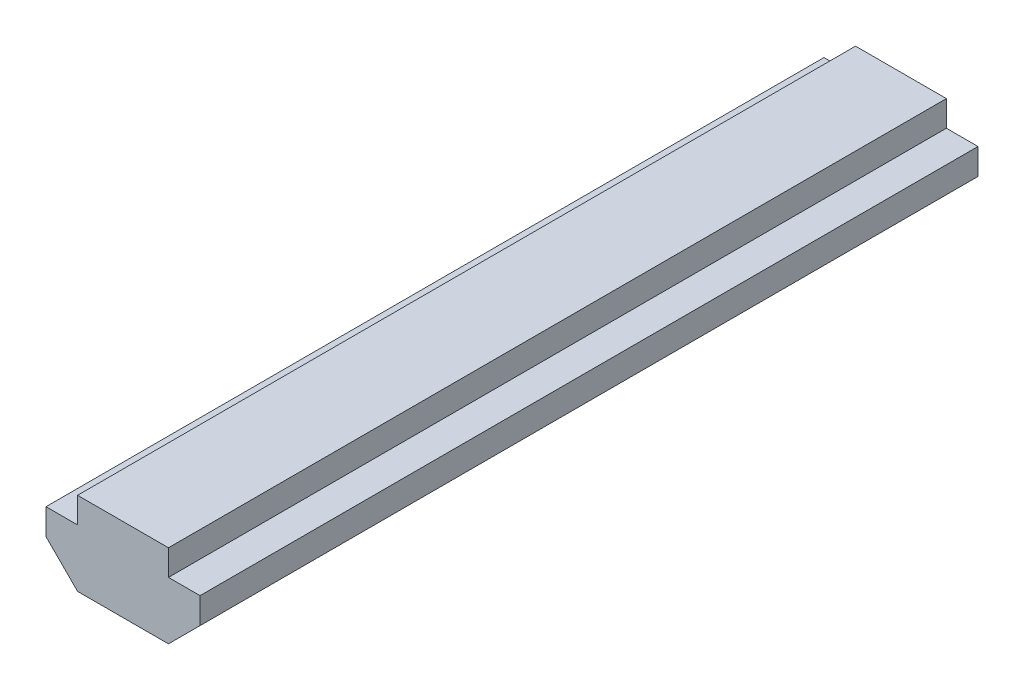
ISO-10303-21;
HEADER;
FILE_DESCRIPTION(('STEP AP214'),'2;1');
FILE_NAME('part.step','',(''),(''),'','','');
FILE_SCHEMA(('AUTOMOTIVE_DESIGN { 1 0 10303 214 1 1 1 1 }'));
ENDSEC;
DATA;
#1=APPLICATION_CONTEXT('core data for automotive mechanical design processes');
#2=APPLICATION_PROTOCOL_DEFINITION('international standard','automotive_design',2000,#1);
#3=PRODUCT_CONTEXT('',#1,'mechanical');
#4=PRODUCT('Part','Part','',(#3));
#5=PRODUCT_RELATED_PRODUCT_CATEGORY('part','',(#4));
#6=PRODUCT_DEFINITION_FORMATION('','',#4);
#7=PRODUCT_DEFINITION_CONTEXT('part definition',#1,'design');
#8=PRODUCT_DEFINITION('design','',#6,#7);
#9=PRODUCT_DEFINITION_SHAPE('','',#8);
#10=(LENGTH_UNIT() NAMED_UNIT(*) SI_UNIT(.MILLI.,.METRE.));
#11=(NAMED_UNIT(*) PLANE_ANGLE_UNIT() SI_UNIT($,.RADIAN.));
#12=(NAMED_UNIT(*) SI_UNIT($,.STERADIAN.) SOLID_ANGLE_UNIT());
#13=UNCERTAINTY_MEASURE_WITH_UNIT(LENGTH_MEASURE(1.E-05),#10,'distance_accuracy_value','');
#14=(GEOMETRIC_REPRESENTATION_CONTEXT(3) GLOBAL_UNCERTAINTY_ASSIGNED_CONTEXT((#13)) GLOBAL_UNIT_ASSIGNED_CONTEXT((#10,
#11,#12)) REPRESENTATION_CONTEXT('',''));
#15=CARTESIAN_POINT('',(0.,0.,0.));
#16=DIRECTION('',(0.,0.,1.));
#17=DIRECTION('',(1.,0.,0.));
#18=AXIS2_PLACEMENT_3D('',#15,#16,#17);
#19=CARTESIAN_POINT('',(4.0600000000004,-7.40000000000009,100.));
#20=DIRECTION('',(0.707106781186548,0.707106781186548,0.));
#21=DIRECTION('',(-0.707106781186548,0.707106781186548,0.));
#22=AXIS2_PLACEMENT_3D('',#19,#20,#21);
#23=PLANE('',#22);
#24=DIRECTION('',(0.707106781186548,-0.707106781186548,0.));
#25=VECTOR('',#24,1.);
#26=CARTESIAN_POINT('',(4.0600000000004,-7.40000000000009,0.));
#27=LINE('',#26,#25);
#28=CARTESIAN_POINT('',(4.5102810375397E-13,-3.34000000000015,0.));
#29=VERTEX_POINT('',#28);
#30=CARTESIAN_POINT('',(4.0600000000004,-7.40000000000009,0.));
#31=VERTEX_POINT('',#30);
#32=EDGE_CURVE('E143',#29,#31,#27,.T.);
#33=ORIENTED_EDGE('',*,*,#32,.T.);
#34=DIRECTION('',(0.,0.,-1.));
#35=VECTOR('',#34,1.);
#36=CARTESIAN_POINT('',(4.0600000000004,-7.40000000000009,100.));
#37=LINE('',#36,#35);
#38=CARTESIAN_POINT('',(4.0600000000004,-7.40000000000009,100.));
#39=VERTEX_POINT('',#38);
#40=EDGE_CURVE('E11',#39,#31,#37,.T.);
#41=ORIENTED_EDGE('',*,*,#40,.F.);
#42=DIRECTION('',(0.707106781186548,-0.707106781186548,0.));
#43=VECTOR('',#42,1.);
#44=CARTESIAN_POINT('',(4.0600000000004,-7.40000000000009,100.));
#45=LINE('',#44,#43);
#46=CARTESIAN_POINT('',(4.5102810375397E-13,-3.34000000000015,100.));
#47=VERTEX_POINT('',#46);
#48=EDGE_CURVE('E161',#47,#39,#45,.T.);
#49=ORIENTED_EDGE('',*,*,#48,.F.);
#50=DIRECTION('',(0.,0.,-1.));
#51=VECTOR('',#50,1.);
#52=CARTESIAN_POINT('',(4.5102810375397E-13,-3.34000000000015,100.));
#53=LINE('',#52,#51);
#54=EDGE_CURVE('E139',#47,#29,#53,.T.);
#55=ORIENTED_EDGE('',*,*,#54,.T.);
#56=EDGE_LOOP('',(#33,#41,#49,#55));
#57=FACE_BOUND('',#56,.T.);
#58=ADVANCED_FACE('F35',(#57),#23,.F.);
#59=CARTESIAN_POINT('',(4.0600000000004,-7.40000000000009,100.));
#60=DIRECTION('',(0.,1.,0.));
#61=DIRECTION('',(0.,0.,1.));
#62=AXIS2_PLACEMENT_3D('',#59,#60,#61);
#63=PLANE('',#62);
#64=DIRECTION('',(1.,0.,0.));
#65=VECTOR('',#64,1.);
#66=CARTESIAN_POINT('',(4.0600000000004,-7.40000000000009,0.));
#67=LINE('',#66,#65);
#68=CARTESIAN_POINT('',(15.7400000000007,-7.40000000000009,0.));
#69=VERTEX_POINT('',#68);
#70=EDGE_CURVE('E146',#31,#69,#67,.T.);
#71=ORIENTED_EDGE('',*,*,#70,.T.);
#72=DIRECTION('',(0.,0.,-1.));
#73=VECTOR('',#72,1.);
#74=CARTESIAN_POINT('',(15.7400000000007,-7.40000000000009,100.));
#75=LINE('',#74,#73);
#76=CARTESIAN_POINT('',(15.7400000000007,-7.40000000000009,100.));
#77=VERTEX_POINT('',#76);
#78=EDGE_CURVE('E43',#77,#69,#75,.T.);
#79=ORIENTED_EDGE('',*,*,#78,.F.);
#80=DIRECTION('',(1.,0.,0.));
#81=VECTOR('',#80,1.);
#82=CARTESIAN_POINT('',(4.0600000000004,-7.40000000000009,100.));
#83=LINE('',#82,#81);
#84=EDGE_CURVE('E100',#39,#77,#83,.T.);
#85=ORIENTED_EDGE('',*,*,#84,.F.);
#86=ORIENTED_EDGE('',*,*,#40,.T.);
#87=EDGE_LOOP('',(#71,#79,#85,#86));
#88=FACE_BOUND('',#87,.T.);
#89=ADVANCED_FACE('F210',(#88),#63,.F.);
#90=CARTESIAN_POINT('',(15.7400000000007,-7.40000000000009,100.));
#91=DIRECTION('',(-0.707106781186548,0.707106781186548,0.));
#92=DIRECTION('',(-0.707106781186548,-0.707106781186548,0.));
#93=AXIS2_PLACEMENT_3D('',#90,#91,#92);
#94=PLANE('',#93);
#95=DIRECTION('',(0.707106781186548,0.707106781186548,0.));
#96=VECTOR('',#95,1.);
#97=CARTESIAN_POINT('',(15.7400000000007,-7.40000000000009,0.));
#98=LINE('',#97,#96);
#99=CARTESIAN_POINT('',(19.8000000000006,-3.34000000000015,0.));
#100=VERTEX_POINT('',#99);
#101=EDGE_CURVE('E148',#69,#100,#98,.T.);
#102=ORIENTED_EDGE('',*,*,#101,.T.);
#103=DIRECTION('',(0.,0.,-1.));
#104=VECTOR('',#103,1.);
#105=CARTESIAN_POINT('',(19.8000000000006,-3.34000000000015,100.));
#106=LINE('',#105,#104);
#107=CARTESIAN_POINT('',(19.8000000000006,-3.34000000000015,100.));
#108=VERTEX_POINT('',#107);
#109=EDGE_CURVE('E174',#108,#100,#106,.T.);
#110=ORIENTED_EDGE('',*,*,#109,.F.);
#111=DIRECTION('',(0.707106781186548,0.707106781186548,0.));
#112=VECTOR('',#111,1.);
#113=CARTESIAN_POINT('',(15.7400000000007,-7.40000000000009,100.));
#114=LINE('',#113,#112);
#115=EDGE_CURVE('E182',#77,#108,#114,.T.);
#116=ORIENTED_EDGE('',*,*,#115,.F.);
#117=ORIENTED_EDGE('',*,*,#78,.T.);
#118=EDGE_LOOP('',(#102,#110,#116,#117));
#119=FACE_BOUND('',#118,.T.);
#120=ADVANCED_FACE('F180',(#119),#94,.F.);
#121=CARTESIAN_POINT('',(19.8000000000006,-3.34000000000015,100.));
#122=DIRECTION('',(-1.,0.,0.));
#123=DIRECTION('',(0.,0.,1.));
#124=AXIS2_PLACEMENT_3D('',#121,#122,#123);
#125=PLANE('',#124);
#126=DIRECTION('',(0.,1.,0.));
#127=VECTOR('',#126,1.);
#128=CARTESIAN_POINT('',(19.8000000000006,-3.34000000000015,0.));
#129=LINE('',#128,#127);
#130=CARTESIAN_POINT('',(19.8000000000006,0.,0.));
#131=VERTEX_POINT('',#130);
#132=EDGE_CURVE('E150',#100,#131,#129,.T.);
#133=ORIENTED_EDGE('',*,*,#132,.T.);
#134=DIRECTION('',(0.,0.,-1.));
#135=VECTOR('',#134,1.);
#136=CARTESIAN_POINT('',(19.8000000000006,0.,100.));
#137=LINE('',#136,#135);
#138=CARTESIAN_POINT('',(19.8000000000006,0.,100.));
#139=VERTEX_POINT('',#138);
#140=EDGE_CURVE('E171',#139,#131,#137,.T.);
#141=ORIENTED_EDGE('',*,*,#140,.F.);
#142=DIRECTION('',(0.,1.,0.));
#143=VECTOR('',#142,1.);
#144=CARTESIAN_POINT('',(19.8000000000006,-3.34000000000015,100.));
#145=LINE('',#144,#143);
#146=EDGE_CURVE('E200',#108,#139,#145,.T.);
#147=ORIENTED_EDGE('',*,*,#146,.F.);
#148=ORIENTED_EDGE('',*,*,#109,.T.);
#149=EDGE_LOOP('',(#133,#141,#147,#148));
#150=FACE_BOUND('',#149,.T.);
#151=ADVANCED_FACE('F191',(#150),#125,.F.);
#152=CARTESIAN_POINT('',(15.7400000000007,1.11022302462516E-13,100.));
#153=DIRECTION('',(0.,-1.,0.));
#154=DIRECTION('',(1.,0.,0.));
#155=AXIS2_PLACEMENT_3D('',#152,#153,#154);
#156=PLANE('',#155);
#157=DIRECTION('',(-1.,0.,0.));
#158=VECTOR('',#157,1.);
#159=CARTESIAN_POINT('',(15.7400000000007,1.11022302462516E-13,0.));
#160=LINE('',#159,#158);
#161=CARTESIAN_POINT('',(15.7400000000007,1.11022302462516E-13,0.));
#162=VERTEX_POINT('',#161);
#163=EDGE_CURVE('E152',#131,#162,#160,.T.);
#164=ORIENTED_EDGE('',*,*,#163,.T.);
#165=DIRECTION('',(0.,0.,-1.));
#166=VECTOR('',#165,1.);
#167=CARTESIAN_POINT('',(15.7400000000007,1.11022302462516E-13,100.));
#168=LINE('',#167,#166);
#169=CARTESIAN_POINT('',(15.7400000000007,1.11022302462516E-13,100.));
#170=VERTEX_POINT('',#169);
#171=EDGE_CURVE('E168',#170,#162,#168,.T.);
#172=ORIENTED_EDGE('',*,*,#171,.F.);
#173=DIRECTION('',(-1.,0.,0.));
#174=VECTOR('',#173,1.);
#175=CARTESIAN_POINT('',(15.7400000000007,1.11022302462516E-13,100.));
#176=LINE('',#175,#174);
#177=EDGE_CURVE('E197',#139,#170,#176,.T.);
#178=ORIENTED_EDGE('',*,*,#177,.F.);
#179=ORIENTED_EDGE('',*,*,#140,.T.);
#180=EDGE_LOOP('',(#164,#172,#178,#179));
#181=FACE_BOUND('',#180,.T.);
#182=ADVANCED_FACE('F195',(#181),#156,.F.);
#183=CARTESIAN_POINT('',(15.7400000000007,1.11022302462516E-13,100.));
#184=DIRECTION('',(-1.,0.,0.));
#185=DIRECTION('',(0.,0.,1.));
#186=AXIS2_PLACEMENT_3D('',#183,#184,#185);
#187=PLANE('',#186);
#188=DIRECTION('',(0.,1.,0.));
#189=VECTOR('',#188,1.);
#190=CARTESIAN_POINT('',(15.7400000000007,1.11022302462516E-13,0.));
#191=LINE('',#190,#189);
#192=CARTESIAN_POINT('',(15.7400000000007,3.29999999999995,0.));
#193=VERTEX_POINT('',#192);
#194=EDGE_CURVE('E154',#162,#193,#191,.T.);
#195=ORIENTED_EDGE('',*,*,#194,.T.);
#196=DIRECTION('',(0.,0.,-1.));
#197=VECTOR('',#196,1.);
#198=CARTESIAN_POINT('',(15.7400000000007,3.29999999999995,100.));
#199=LINE('',#198,#197);
#200=CARTESIAN_POINT('',(15.7400000000007,3.29999999999995,100.));
#201=VERTEX_POINT('',#200);
#202=EDGE_CURVE('E165',#201,#193,#199,.T.);
#203=ORIENTED_EDGE('',*,*,#202,.F.);
#204=DIRECTION('',(0.,1.,0.));
#205=VECTOR('',#204,1.);
#206=CARTESIAN_POINT('',(15.7400000000007,1.11022302462516E-13,100.));
#207=LINE('',#206,#205);
#208=EDGE_CURVE('E199',#170,#201,#207,.T.);
#209=ORIENTED_EDGE('',*,*,#208,.F.);
#210=ORIENTED_EDGE('',*,*,#171,.T.);
#211=EDGE_LOOP('',(#195,#203,#209,#210));
#212=FACE_BOUND('',#211,.T.);
#213=ADVANCED_FACE('F222',(#212),#187,.F.);
#214=CARTESIAN_POINT('',(4.0600000000004,3.29999999999995,100.));
#215=DIRECTION('',(0.,-1.,0.));
#216=DIRECTION('',(0.,0.,-1.));
#217=AXIS2_PLACEMENT_3D('',#214,#215,#216);
#218=PLANE('',#217);
#219=DIRECTION('',(-1.,0.,0.));
#220=VECTOR('',#219,1.);
#221=CARTESIAN_POINT('',(4.0600000000004,3.29999999999995,0.));
#222=LINE('',#221,#220);
#223=CARTESIAN_POINT('',(4.0600000000004,3.29999999999995,0.));
#224=VERTEX_POINT('',#223);
#225=EDGE_CURVE('E156',#193,#224,#222,.T.);
#226=ORIENTED_EDGE('',*,*,#225,.T.);
#227=DIRECTION('',(0.,0.,-1.));
#228=VECTOR('',#227,1.);
#229=CARTESIAN_POINT('',(4.0600000000004,3.29999999999995,100.));
#230=LINE('',#229,#228);
#231=CARTESIAN_POINT('',(4.0600000000004,3.29999999999995,100.));
#232=VERTEX_POINT('',#231);
#233=EDGE_CURVE('E134',#232,#224,#230,.T.);
#234=ORIENTED_EDGE('',*,*,#233,.F.);
#235=DIRECTION('',(-1.,0.,0.));
#236=VECTOR('',#235,1.);
#237=CARTESIAN_POINT('',(4.0600000000004,3.29999999999995,100.));
#238=LINE('',#237,#236);
#239=EDGE_CURVE('E125',#201,#232,#238,.T.);
#240=ORIENTED_EDGE('',*,*,#239,.F.);
#241=ORIENTED_EDGE('',*,*,#202,.T.);
#242=EDGE_LOOP('',(#226,#234,#240,#241));
#243=FACE_BOUND('',#242,.T.);
#244=ADVANCED_FACE('F225',(#243),#218,.F.);
#245=CARTESIAN_POINT('',(4.0600000000004,1.11022302462516E-13,100.));
#246=DIRECTION('',(1.,0.,0.));
#247=DIRECTION('',(0.,0.,-1.));
#248=AXIS2_PLACEMENT_3D('',#245,#246,#247);
#249=PLANE('',#248);
#250=DIRECTION('',(0.,-1.,0.));
#251=VECTOR('',#250,1.);
#252=CARTESIAN_POINT('',(4.0600000000004,1.11022302462516E-13,0.));
#253=LINE('',#252,#251);
#254=CARTESIAN_POINT('',(4.0600000000004,1.11022302462516E-13,0.));
#255=VERTEX_POINT('',#254);
#256=EDGE_CURVE('E133',#224,#255,#253,.T.);
#257=ORIENTED_EDGE('',*,*,#256,.T.);
#258=DIRECTION('',(0.,0.,-1.));
#259=VECTOR('',#258,1.);
#260=CARTESIAN_POINT('',(4.0600000000004,1.11022302462516E-13,100.));
#261=LINE('',#260,#259);
#262=CARTESIAN_POINT('',(4.0600000000004,1.11022302462516E-13,100.));
#263=VERTEX_POINT('',#262);
#264=EDGE_CURVE('E130',#263,#255,#261,.T.);
#265=ORIENTED_EDGE('',*,*,#264,.F.);
#266=DIRECTION('',(0.,-1.,0.));
#267=VECTOR('',#266,1.);
#268=CARTESIAN_POINT('',(4.0600000000004,1.11022302462516E-13,100.));
#269=LINE('',#268,#267);
#270=EDGE_CURVE('E119',#232,#263,#269,.T.);
#271=ORIENTED_EDGE('',*,*,#270,.F.);
#272=ORIENTED_EDGE('',*,*,#233,.T.);
#273=EDGE_LOOP('',(#257,#265,#271,#272));
#274=FACE_BOUND('',#273,.T.);
#275=ADVANCED_FACE('F131',(#274),#249,.F.);
#276=CARTESIAN_POINT('',(0.,0.,100.));
#277=DIRECTION('',(0.,-1.,0.));
#278=DIRECTION('',(1.,0.,0.));
#279=AXIS2_PLACEMENT_3D('',#276,#277,#278);
#280=PLANE('',#279);
#281=DIRECTION('',(-1.,0.,0.));
#282=VECTOR('',#281,1.);
#283=CARTESIAN_POINT('',(0.,0.,0.));
#284=LINE('',#283,#282);
#285=CARTESIAN_POINT('',(0.,0.,0.));
#286=VERTEX_POINT('',#285);
#287=EDGE_CURVE('E86',#255,#286,#284,.T.);
#288=ORIENTED_EDGE('',*,*,#287,.T.);
#289=DIRECTION('',(0.,0.,-1.));
#290=VECTOR('',#289,1.);
#291=CARTESIAN_POINT('',(0.,0.,100.));
#292=LINE('',#291,#290);
#293=CARTESIAN_POINT('',(0.,0.,100.));
#294=VERTEX_POINT('',#293);
#295=EDGE_CURVE('E135',#294,#286,#292,.T.);
#296=ORIENTED_EDGE('',*,*,#295,.F.);
#297=DIRECTION('',(-1.,0.,0.));
#298=VECTOR('',#297,1.);
#299=CARTESIAN_POINT('',(0.,0.,100.));
#300=LINE('',#299,#298);
#301=EDGE_CURVE('E123',#263,#294,#300,.T.);
#302=ORIENTED_EDGE('',*,*,#301,.F.);
#303=ORIENTED_EDGE('',*,*,#264,.T.);
#304=EDGE_LOOP('',(#288,#296,#302,#303));
#305=FACE_BOUND('',#304,.T.);
#306=ADVANCED_FACE('F137',(#305),#280,.F.);
#307=CARTESIAN_POINT('',(4.5102810375397E-13,-3.34000000000015,100.));
#308=DIRECTION('',(1.,1.36077110989791E-13,0.));
#309=DIRECTION('',(-1.36077110989791E-13,1.,0.));
#310=AXIS2_PLACEMENT_3D('',#307,#308,#309);
#311=PLANE('',#310);
#312=DIRECTION('',(1.36077110989791E-13,-1.,0.));
#313=VECTOR('',#312,1.);
#314=CARTESIAN_POINT('',(4.5102810375397E-13,-3.34000000000015,0.));
#315=LINE('',#314,#313);
#316=EDGE_CURVE('E92',#286,#29,#315,.T.);
#317=ORIENTED_EDGE('',*,*,#316,.T.);
#318=ORIENTED_EDGE('',*,*,#54,.F.);
#319=DIRECTION('',(1.36077110989791E-13,-1.,0.));
#320=VECTOR('',#319,1.);
#321=CARTESIAN_POINT('',(4.5102810375397E-13,-3.34000000000015,100.));
#322=LINE('',#321,#320);
#323=EDGE_CURVE('E51',#294,#47,#322,.T.);
#324=ORIENTED_EDGE('',*,*,#323,.F.);
#325=ORIENTED_EDGE('',*,*,#295,.T.);
#326=EDGE_LOOP('',(#317,#318,#324,#325));
#327=FACE_BOUND('',#326,.T.);
#328=ADVANCED_FACE('F234',(#327),#311,.F.);
#329=CARTESIAN_POINT('',(0.,0.,100.));
#330=DIRECTION('',(0.,0.,-1.));
#331=DIRECTION('',(-1.,0.,0.));
#332=AXIS2_PLACEMENT_3D('',#329,#330,#331);
#333=PLANE('',#332);
#334=ORIENTED_EDGE('',*,*,#48,.T.);
#335=ORIENTED_EDGE('',*,*,#84,.T.);
#336=ORIENTED_EDGE('',*,*,#115,.T.);
#337=ORIENTED_EDGE('',*,*,#146,.T.);
#338=ORIENTED_EDGE('',*,*,#177,.T.);
#339=ORIENTED_EDGE('',*,*,#208,.T.);
#340=ORIENTED_EDGE('',*,*,#239,.T.);
#341=ORIENTED_EDGE('',*,*,#270,.T.);
#342=ORIENTED_EDGE('',*,*,#301,.T.);
#343=ORIENTED_EDGE('',*,*,#323,.T.);
#344=EDGE_LOOP('',(#334,#335,#336,#337,#338,#339,#340,#341,#342,#343));
#345=FACE_BOUND('',#344,.T.);
#346=ADVANCED_FACE('F121',(#345),#333,.F.);
#347=CARTESIAN_POINT('',(0.,0.,0.));
#348=DIRECTION('',(0.,0.,-1.));
#349=DIRECTION('',(-1.,0.,0.));
#350=AXIS2_PLACEMENT_3D('',#347,#348,#349);
#351=PLANE('',#350);
#352=ORIENTED_EDGE('',*,*,#32,.F.);
#353=ORIENTED_EDGE('',*,*,#316,.F.);
#354=ORIENTED_EDGE('',*,*,#287,.F.);
#355=ORIENTED_EDGE('',*,*,#256,.F.);
#356=ORIENTED_EDGE('',*,*,#225,.F.);
#357=ORIENTED_EDGE('',*,*,#194,.F.);
#358=ORIENTED_EDGE('',*,*,#163,.F.);
#359=ORIENTED_EDGE('',*,*,#132,.F.);
#360=ORIENTED_EDGE('',*,*,#101,.F.);
#361=ORIENTED_EDGE('',*,*,#70,.F.);
#362=EDGE_LOOP('',(#352,#353,#354,#355,#356,#357,#358,#359,#360,#361));
#363=FACE_BOUND('',#362,.T.);
#364=ADVANCED_FACE('F186',(#363),#351,.T.);
#365=CLOSED_SHELL('',(#58,#89,#120,#151,#182,#213,#244,#275,#306,#328,#346,#364));
#366=MANIFOLD_SOLID_BREP('B2',#365);
#367=ADVANCED_BREP_SHAPE_REPRESENTATION('',(#18,#366),#14);
#368=SHAPE_DEFINITION_REPRESENTATION(#9,#367);
ENDSEC;
END-ISO-10303-21;
